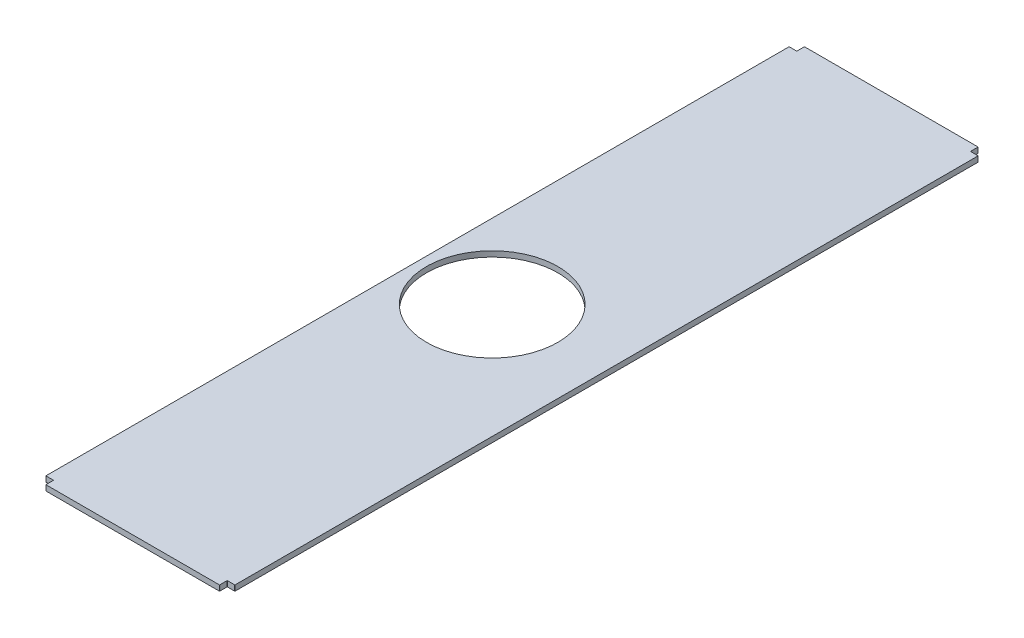
ISO-10303-21;
HEADER;
FILE_DESCRIPTION(('STEP AP214'),'2;1');
FILE_NAME('part.step','',(''),(''),'','','');
FILE_SCHEMA(('AUTOMOTIVE_DESIGN { 1 0 10303 214 1 1 1 1 }'));
ENDSEC;
DATA;
#1=APPLICATION_CONTEXT('core data for automotive mechanical design processes');
#2=APPLICATION_PROTOCOL_DEFINITION('international standard','automotive_design',2000,#1);
#3=PRODUCT_CONTEXT('',#1,'mechanical');
#4=PRODUCT('Part','Part','',(#3));
#5=PRODUCT_RELATED_PRODUCT_CATEGORY('part','',(#4));
#6=PRODUCT_DEFINITION_FORMATION('','',#4);
#7=PRODUCT_DEFINITION_CONTEXT('part definition',#1,'design');
#8=PRODUCT_DEFINITION('design','',#6,#7);
#9=PRODUCT_DEFINITION_SHAPE('','',#8);
#10=(LENGTH_UNIT() NAMED_UNIT(*) SI_UNIT(.MILLI.,.METRE.));
#11=(NAMED_UNIT(*) PLANE_ANGLE_UNIT() SI_UNIT($,.RADIAN.));
#12=(NAMED_UNIT(*) SI_UNIT($,.STERADIAN.) SOLID_ANGLE_UNIT());
#13=UNCERTAINTY_MEASURE_WITH_UNIT(LENGTH_MEASURE(1.E-05),#10,'distance_accuracy_value','');
#14=(GEOMETRIC_REPRESENTATION_CONTEXT(3) GLOBAL_UNCERTAINTY_ASSIGNED_CONTEXT((#13)) GLOBAL_UNIT_ASSIGNED_CONTEXT((#10,
#11,#12)) REPRESENTATION_CONTEXT('',''));
#15=CARTESIAN_POINT('',(0.,0.,0.));
#16=DIRECTION('',(0.,0.,1.));
#17=DIRECTION('',(1.,0.,0.));
#18=AXIS2_PLACEMENT_3D('',#15,#16,#17);
#19=CARTESIAN_POINT('',(0.,6.35,-879.7036));
#20=DIRECTION('',(0.,0.,1.));
#21=DIRECTION('',(1.,0.,0.));
#22=AXIS2_PLACEMENT_3D('',#19,#20,#21);
#23=PLANE('',#22);
#24=DIRECTION('',(-1.,0.,0.));
#25=VECTOR('',#24,1.);
#26=CARTESIAN_POINT('',(0.,6.35,-879.7036));
#27=LINE('',#26,#25);
#28=CARTESIAN_POINT('',(210.058,6.35,-879.7036));
#29=VERTEX_POINT('',#28);
#30=CARTESIAN_POINT('',(9.144,6.35,-879.7036));
#31=VERTEX_POINT('',#30);
#32=EDGE_CURVE('E272',#29,#31,#27,.T.);
#33=ORIENTED_EDGE('',*,*,#32,.F.);
#34=DIRECTION('',(0.,1.,0.));
#35=VECTOR('',#34,1.);
#36=CARTESIAN_POINT('',(210.058,6.35,-879.7036));
#37=LINE('',#36,#35);
#38=CARTESIAN_POINT('',(210.058,0.,-879.7036));
#39=VERTEX_POINT('',#38);
#40=EDGE_CURVE('E210',#29,#39,#37,.F.);
#41=ORIENTED_EDGE('',*,*,#40,.T.);
#42=DIRECTION('',(-1.,0.,0.));
#43=VECTOR('',#42,1.);
#44=CARTESIAN_POINT('',(0.,0.,-879.7036));
#45=LINE('',#44,#43);
#46=CARTESIAN_POINT('',(9.144,0.,-879.7036));
#47=VERTEX_POINT('',#46);
#48=EDGE_CURVE('E266',#39,#47,#45,.T.);
#49=ORIENTED_EDGE('',*,*,#48,.T.);
#50=DIRECTION('',(0.,1.,0.));
#51=VECTOR('',#50,1.);
#52=CARTESIAN_POINT('',(9.144,6.35,-879.7036));
#53=LINE('',#52,#51);
#54=EDGE_CURVE('E216',#47,#31,#53,.T.);
#55=ORIENTED_EDGE('',*,*,#54,.T.);
#56=EDGE_LOOP('',(#33,#41,#49,#55));
#57=FACE_BOUND('',#56,.T.);
#58=ADVANCED_FACE('F42',(#57),#23,.F.);
#59=CARTESIAN_POINT('',(0.,6.35,0.));
#60=DIRECTION('',(1.,0.,0.));
#61=DIRECTION('',(0.,0.,-1.));
#62=AXIS2_PLACEMENT_3D('',#59,#60,#61);
#63=PLANE('',#62);
#64=DIRECTION('',(0.,0.,1.));
#65=VECTOR('',#64,1.);
#66=CARTESIAN_POINT('',(0.,6.35,0.));
#67=LINE('',#66,#65);
#68=CARTESIAN_POINT('',(0.,6.35,-870.5596));
#69=VERTEX_POINT('',#68);
#70=CARTESIAN_POINT('',(0.,6.35,-9.144));
#71=VERTEX_POINT('',#70);
#72=EDGE_CURVE('E275',#69,#71,#67,.T.);
#73=ORIENTED_EDGE('',*,*,#72,.F.);
#74=DIRECTION('',(0.,1.,0.));
#75=VECTOR('',#74,1.);
#76=CARTESIAN_POINT('',(0.,6.35,-870.5596));
#77=LINE('',#76,#75);
#78=CARTESIAN_POINT('',(0.,0.,-870.5596));
#79=VERTEX_POINT('',#78);
#80=EDGE_CURVE('E65',#69,#79,#77,.F.);
#81=ORIENTED_EDGE('',*,*,#80,.T.);
#82=DIRECTION('',(0.,0.,1.));
#83=VECTOR('',#82,1.);
#84=CARTESIAN_POINT('',(0.,0.,0.));
#85=LINE('',#84,#83);
#86=CARTESIAN_POINT('',(0.,0.,-9.144));
#87=VERTEX_POINT('',#86);
#88=EDGE_CURVE('E291',#79,#87,#85,.T.);
#89=ORIENTED_EDGE('',*,*,#88,.T.);
#90=DIRECTION('',(0.,1.,0.));
#91=VECTOR('',#90,1.);
#92=CARTESIAN_POINT('',(0.,6.35,-9.144));
#93=LINE('',#92,#91);
#94=EDGE_CURVE('E371',#87,#71,#93,.T.);
#95=ORIENTED_EDGE('',*,*,#94,.T.);
#96=EDGE_LOOP('',(#73,#81,#89,#95));
#97=FACE_BOUND('',#96,.T.);
#98=ADVANCED_FACE('F511',(#97),#63,.F.);
#99=CARTESIAN_POINT('',(219.202,6.35,0.));
#100=DIRECTION('',(0.,0.,-1.));
#101=DIRECTION('',(-1.,0.,0.));
#102=AXIS2_PLACEMENT_3D('',#99,#100,#101);
#103=PLANE('',#102);
#104=DIRECTION('',(1.,0.,0.));
#105=VECTOR('',#104,1.);
#106=CARTESIAN_POINT('',(219.202,6.35,0.));
#107=LINE('',#106,#105);
#108=CARTESIAN_POINT('',(9.14399999999999,6.35,0.));
#109=VERTEX_POINT('',#108);
#110=CARTESIAN_POINT('',(210.058,6.35,0.));
#111=VERTEX_POINT('',#110);
#112=EDGE_CURVE('E280',#109,#111,#107,.T.);
#113=ORIENTED_EDGE('',*,*,#112,.F.);
#114=DIRECTION('',(0.,1.,0.));
#115=VECTOR('',#114,1.);
#116=CARTESIAN_POINT('',(9.14399999999999,6.35,0.));
#117=LINE('',#116,#115);
#118=CARTESIAN_POINT('',(9.14399999999999,0.,0.));
#119=VERTEX_POINT('',#118);
#120=EDGE_CURVE('E395',#109,#119,#117,.F.);
#121=ORIENTED_EDGE('',*,*,#120,.T.);
#122=DIRECTION('',(1.,0.,0.));
#123=VECTOR('',#122,1.);
#124=CARTESIAN_POINT('',(219.202,0.,0.));
#125=LINE('',#124,#123);
#126=CARTESIAN_POINT('',(210.058,0.,0.));
#127=VERTEX_POINT('',#126);
#128=EDGE_CURVE('E294',#119,#127,#125,.T.);
#129=ORIENTED_EDGE('',*,*,#128,.T.);
#130=DIRECTION('',(0.,1.,0.));
#131=VECTOR('',#130,1.);
#132=CARTESIAN_POINT('',(210.058,6.35,0.));
#133=LINE('',#132,#131);
#134=EDGE_CURVE('E391',#127,#111,#133,.T.);
#135=ORIENTED_EDGE('',*,*,#134,.T.);
#136=EDGE_LOOP('',(#113,#121,#129,#135));
#137=FACE_BOUND('',#136,.T.);
#138=ADVANCED_FACE('F517',(#137),#103,.F.);
#139=CARTESIAN_POINT('',(219.202,6.35,0.));
#140=DIRECTION('',(-1.,0.,0.));
#141=DIRECTION('',(0.,0.,1.));
#142=AXIS2_PLACEMENT_3D('',#139,#140,#141);
#143=PLANE('',#142);
#144=DIRECTION('',(0.,0.,-1.));
#145=VECTOR('',#144,1.);
#146=CARTESIAN_POINT('',(219.202,0.,0.));
#147=LINE('',#146,#145);
#148=CARTESIAN_POINT('',(219.202,0.,-9.144));
#149=VERTEX_POINT('',#148);
#150=CARTESIAN_POINT('',(219.202,0.,-870.5596));
#151=VERTEX_POINT('',#150);
#152=EDGE_CURVE('E276',#149,#151,#147,.T.);
#153=ORIENTED_EDGE('',*,*,#152,.T.);
#154=DIRECTION('',(0.,1.,0.));
#155=VECTOR('',#154,1.);
#156=CARTESIAN_POINT('',(219.202,6.35,-870.5596));
#157=LINE('',#156,#155);
#158=CARTESIAN_POINT('',(219.202,6.35,-870.5596));
#159=VERTEX_POINT('',#158);
#160=EDGE_CURVE('E360',#151,#159,#157,.T.);
#161=ORIENTED_EDGE('',*,*,#160,.T.);
#162=DIRECTION('',(0.,0.,-1.));
#163=VECTOR('',#162,1.);
#164=CARTESIAN_POINT('',(219.202,6.35,0.));
#165=LINE('',#164,#163);
#166=CARTESIAN_POINT('',(219.202,6.35,-9.144));
#167=VERTEX_POINT('',#166);
#168=EDGE_CURVE('E284',#167,#159,#165,.T.);
#169=ORIENTED_EDGE('',*,*,#168,.F.);
#170=DIRECTION('',(0.,1.,0.));
#171=VECTOR('',#170,1.);
#172=CARTESIAN_POINT('',(219.202,6.35,-9.144));
#173=LINE('',#172,#171);
#174=EDGE_CURVE('E357',#167,#149,#173,.F.);
#175=ORIENTED_EDGE('',*,*,#174,.T.);
#176=EDGE_LOOP('',(#153,#161,#169,#175));
#177=FACE_BOUND('',#176,.T.);
#178=ADVANCED_FACE('F495',(#177),#143,.F.);
#179=CARTESIAN_POINT('',(0.,6.35,0.));
#180=DIRECTION('',(0.,1.,0.));
#181=DIRECTION('',(0.,0.,1.));
#182=AXIS2_PLACEMENT_3D('',#179,#180,#181);
#183=PLANE('',#182);
#184=DIRECTION('',(0.,0.,1.));
#185=VECTOR('',#184,1.);
#186=CARTESIAN_POINT('',(210.312,6.35,-879.7036));
#187=LINE('',#186,#185);
#188=CARTESIAN_POINT('',(210.312,6.35,-879.4496));
#189=VERTEX_POINT('',#188);
#190=CARTESIAN_POINT('',(210.312,6.35,-871.0676));
#191=VERTEX_POINT('',#190);
#192=EDGE_CURVE('E223',#189,#191,#187,.T.);
#193=ORIENTED_EDGE('',*,*,#192,.F.);
#194=CARTESIAN_POINT('',(210.058,6.35,-879.4496));
#195=DIRECTION('',(0.,1.,0.));
#196=DIRECTION('',(0.,0.,1.));
#197=AXIS2_PLACEMENT_3D('',#194,#195,#196);
#198=CIRCLE('',#197,0.254);
#199=EDGE_CURVE('E205',#189,#29,#198,.T.);
#200=ORIENTED_EDGE('',*,*,#199,.T.);
#201=ORIENTED_EDGE('',*,*,#32,.T.);
#202=CARTESIAN_POINT('',(9.144,6.35,-879.4496));
#203=DIRECTION('',(0.,1.,0.));
#204=DIRECTION('',(0.,0.,1.));
#205=AXIS2_PLACEMENT_3D('',#202,#203,#204);
#206=CIRCLE('',#205,0.254);
#207=CARTESIAN_POINT('',(8.89,6.35,-879.4496));
#208=VERTEX_POINT('',#207);
#209=EDGE_CURVE('E314',#31,#208,#206,.T.);
#210=ORIENTED_EDGE('',*,*,#209,.T.);
#211=DIRECTION('',(0.,0.,-1.));
#212=VECTOR('',#211,1.);
#213=CARTESIAN_POINT('',(8.89,6.35,-879.7036));
#214=LINE('',#213,#212);
#215=CARTESIAN_POINT('',(8.89,6.35,-871.0676));
#216=VERTEX_POINT('',#215);
#217=EDGE_CURVE('E253',#216,#208,#214,.T.);
#218=ORIENTED_EDGE('',*,*,#217,.F.);
#219=CARTESIAN_POINT('',(8.636,6.35,-871.0676));
#220=DIRECTION('',(0.,1.,0.));
#221=DIRECTION('',(0.,0.,1.));
#222=AXIS2_PLACEMENT_3D('',#219,#220,#221);
#223=CIRCLE('',#222,0.254);
#224=CARTESIAN_POINT('',(8.636,6.35,-870.8136));
#225=VERTEX_POINT('',#224);
#226=EDGE_CURVE('E424',#216,#225,#223,.F.);
#227=ORIENTED_EDGE('',*,*,#226,.T.);
#228=DIRECTION('',(1.,0.,0.));
#229=VECTOR('',#228,1.);
#230=CARTESIAN_POINT('',(0.,6.35,-870.8136));
#231=LINE('',#230,#229);
#232=CARTESIAN_POINT('',(0.254,6.35,-870.8136));
#233=VERTEX_POINT('',#232);
#234=EDGE_CURVE('E255',#233,#225,#231,.T.);
#235=ORIENTED_EDGE('',*,*,#234,.F.);
#236=CARTESIAN_POINT('',(0.254,6.35,-870.5596));
#237=DIRECTION('',(0.,1.,0.));
#238=DIRECTION('',(0.,0.,1.));
#239=AXIS2_PLACEMENT_3D('',#236,#237,#238);
#240=CIRCLE('',#239,0.254);
#241=EDGE_CURVE('E317',#233,#69,#240,.T.);
#242=ORIENTED_EDGE('',*,*,#241,.T.);
#243=ORIENTED_EDGE('',*,*,#72,.T.);
#244=CARTESIAN_POINT('',(0.254,6.35,-9.144));
#245=DIRECTION('',(0.,1.,0.));
#246=DIRECTION('',(0.,0.,1.));
#247=AXIS2_PLACEMENT_3D('',#244,#245,#246);
#248=CIRCLE('',#247,0.254);
#249=CARTESIAN_POINT('',(0.254,6.35,-8.89));
#250=VERTEX_POINT('',#249);
#251=EDGE_CURVE('E308',#71,#250,#248,.T.);
#252=ORIENTED_EDGE('',*,*,#251,.T.);
#253=DIRECTION('',(-1.,0.,0.));
#254=VECTOR('',#253,1.);
#255=CARTESIAN_POINT('',(0.,6.35,-8.89));
#256=LINE('',#255,#254);
#257=CARTESIAN_POINT('',(8.636,6.35,-8.89));
#258=VERTEX_POINT('',#257);
#259=EDGE_CURVE('E472',#258,#250,#256,.T.);
#260=ORIENTED_EDGE('',*,*,#259,.F.);
#261=CARTESIAN_POINT('',(8.636,6.35,-8.636));
#262=DIRECTION('',(0.,1.,0.));
#263=DIRECTION('',(0.,0.,1.));
#264=AXIS2_PLACEMENT_3D('',#261,#262,#263);
#265=CIRCLE('',#264,0.254);
#266=CARTESIAN_POINT('',(8.89,6.35,-8.636));
#267=VERTEX_POINT('',#266);
#268=EDGE_CURVE('E430',#258,#267,#265,.F.);
#269=ORIENTED_EDGE('',*,*,#268,.T.);
#270=DIRECTION('',(0.,0.,-1.));
#271=VECTOR('',#270,1.);
#272=CARTESIAN_POINT('',(8.89,6.35,0.));
#273=LINE('',#272,#271);
#274=CARTESIAN_POINT('',(8.89,6.35,-0.254));
#275=VERTEX_POINT('',#274);
#276=EDGE_CURVE('E466',#275,#267,#273,.T.);
#277=ORIENTED_EDGE('',*,*,#276,.F.);
#278=CARTESIAN_POINT('',(9.144,6.35,-0.254));
#279=DIRECTION('',(0.,1.,0.));
#280=DIRECTION('',(0.,0.,1.));
#281=AXIS2_PLACEMENT_3D('',#278,#279,#280);
#282=CIRCLE('',#281,0.254);
#283=EDGE_CURVE('E311',#275,#109,#282,.T.);
#284=ORIENTED_EDGE('',*,*,#283,.T.);
#285=ORIENTED_EDGE('',*,*,#112,.T.);
#286=CARTESIAN_POINT('',(210.058,6.35,-0.254000000000002));
#287=DIRECTION('',(0.,1.,0.));
#288=DIRECTION('',(0.,0.,1.));
#289=AXIS2_PLACEMENT_3D('',#286,#287,#288);
#290=CIRCLE('',#289,0.254);
#291=CARTESIAN_POINT('',(210.312,6.35,-0.254000000000002));
#292=VERTEX_POINT('',#291);
#293=EDGE_CURVE('E228',#111,#292,#290,.T.);
#294=ORIENTED_EDGE('',*,*,#293,.T.);
#295=DIRECTION('',(0.,0.,1.));
#296=VECTOR('',#295,1.);
#297=CARTESIAN_POINT('',(210.312,6.35,0.));
#298=LINE('',#297,#296);
#299=CARTESIAN_POINT('',(210.312,6.35,-8.636));
#300=VERTEX_POINT('',#299);
#301=EDGE_CURVE('E442',#300,#292,#298,.T.);
#302=ORIENTED_EDGE('',*,*,#301,.F.);
#303=CARTESIAN_POINT('',(210.566,6.35,-8.636));
#304=DIRECTION('',(0.,1.,0.));
#305=DIRECTION('',(0.,0.,1.));
#306=AXIS2_PLACEMENT_3D('',#303,#304,#305);
#307=CIRCLE('',#306,0.254);
#308=CARTESIAN_POINT('',(210.566,6.35,-8.89));
#309=VERTEX_POINT('',#308);
#310=EDGE_CURVE('E51',#300,#309,#307,.F.);
#311=ORIENTED_EDGE('',*,*,#310,.T.);
#312=DIRECTION('',(-1.,0.,0.));
#313=VECTOR('',#312,1.);
#314=CARTESIAN_POINT('',(219.202,6.35,-8.89));
#315=LINE('',#314,#313);
#316=CARTESIAN_POINT('',(218.948,6.35,-8.89));
#317=VERTEX_POINT('',#316);
#318=EDGE_CURVE('E440',#317,#309,#315,.T.);
#319=ORIENTED_EDGE('',*,*,#318,.F.);
#320=CARTESIAN_POINT('',(218.948,6.35,-9.144));
#321=DIRECTION('',(0.,1.,0.));
#322=DIRECTION('',(0.,0.,1.));
#323=AXIS2_PLACEMENT_3D('',#320,#321,#322);
#324=CIRCLE('',#323,0.254);
#325=EDGE_CURVE('E305',#317,#167,#324,.T.);
#326=ORIENTED_EDGE('',*,*,#325,.T.);
#327=ORIENTED_EDGE('',*,*,#168,.T.);
#328=CARTESIAN_POINT('',(218.948,6.35,-870.5596));
#329=DIRECTION('',(0.,1.,0.));
#330=DIRECTION('',(0.,0.,1.));
#331=AXIS2_PLACEMENT_3D('',#328,#329,#330);
#332=CIRCLE('',#331,0.254);
#333=CARTESIAN_POINT('',(218.948,6.35,-870.8136));
#334=VERTEX_POINT('',#333);
#335=EDGE_CURVE('E217',#159,#334,#332,.T.);
#336=ORIENTED_EDGE('',*,*,#335,.T.);
#337=DIRECTION('',(1.,0.,0.));
#338=VECTOR('',#337,1.);
#339=CARTESIAN_POINT('',(219.202,6.35,-870.8136));
#340=LINE('',#339,#338);
#341=CARTESIAN_POINT('',(210.566,6.35,-870.8136));
#342=VERTEX_POINT('',#341);
#343=EDGE_CURVE('E236',#342,#334,#340,.T.);
#344=ORIENTED_EDGE('',*,*,#343,.F.);
#345=CARTESIAN_POINT('',(210.566,6.35,-871.0676));
#346=DIRECTION('',(0.,1.,0.));
#347=DIRECTION('',(0.,0.,1.));
#348=AXIS2_PLACEMENT_3D('',#345,#346,#347);
#349=CIRCLE('',#348,0.254);
#350=EDGE_CURVE('E234',#342,#191,#349,.F.);
#351=ORIENTED_EDGE('',*,*,#350,.T.);
#352=EDGE_LOOP('',(#193,#200,#201,#210,#218,#227,#235,#242,#243,#252,#260,#269,#277,#284,#285,
#294,#302,#311,#319,#326,#327,#336,#344,#351));
#353=FACE_BOUND('',#352,.T.);
#354=CARTESIAN_POINT('',(86.6393999999993,6.35,-439.851800000002));
#355=DIRECTION('',(0.,1.,0.));
#356=DIRECTION('',(0.,0.,1.));
#357=AXIS2_PLACEMENT_3D('',#354,#355,#356);
#358=CIRCLE('',#357,76.2);
#359=CARTESIAN_POINT('',(86.6393999999993,6.35,-363.651800000002));
#360=VERTEX_POINT('',#359);
#361=EDGE_CURVE('E267',#360,#360,#358,.T.);
#362=ORIENTED_EDGE('',*,*,#361,.F.);
#363=EDGE_LOOP('',(#362));
#364=FACE_BOUND('',#363,.T.);
#365=ADVANCED_FACE('F231',(#353,#364),#183,.T.);
#366=CARTESIAN_POINT('',(0.,0.,0.));
#367=DIRECTION('',(0.,1.,0.));
#368=DIRECTION('',(0.,0.,1.));
#369=AXIS2_PLACEMENT_3D('',#366,#367,#368);
#370=PLANE('',#369);
#371=CARTESIAN_POINT('',(86.6393999999993,0.,-439.851800000002));
#372=DIRECTION('',(0.,1.,0.));
#373=DIRECTION('',(0.,0.,1.));
#374=AXIS2_PLACEMENT_3D('',#371,#372,#373);
#375=CIRCLE('',#374,76.2);
#376=CARTESIAN_POINT('',(86.6393999999993,0.,-363.651800000002));
#377=VERTEX_POINT('',#376);
#378=EDGE_CURVE('E262',#377,#377,#375,.T.);
#379=ORIENTED_EDGE('',*,*,#378,.T.);
#380=EDGE_LOOP('',(#379));
#381=FACE_BOUND('',#380,.T.);
#382=ORIENTED_EDGE('',*,*,#48,.F.);
#383=CARTESIAN_POINT('',(210.058,0.,-879.4496));
#384=DIRECTION('',(0.,1.,0.));
#385=DIRECTION('',(0.,0.,1.));
#386=AXIS2_PLACEMENT_3D('',#383,#384,#385);
#387=CIRCLE('',#386,0.254);
#388=CARTESIAN_POINT('',(210.312,0.,-879.4496));
#389=VERTEX_POINT('',#388);
#390=EDGE_CURVE('E347',#39,#389,#387,.F.);
#391=ORIENTED_EDGE('',*,*,#390,.T.);
#392=DIRECTION('',(0.,0.,1.));
#393=VECTOR('',#392,1.);
#394=CARTESIAN_POINT('',(210.312,0.,-879.7036));
#395=LINE('',#394,#393);
#396=CARTESIAN_POINT('',(210.312,0.,-871.0676));
#397=VERTEX_POINT('',#396);
#398=EDGE_CURVE('E226',#389,#397,#395,.T.);
#399=ORIENTED_EDGE('',*,*,#398,.T.);
#400=CARTESIAN_POINT('',(210.566,0.,-871.0676));
#401=DIRECTION('',(0.,1.,0.));
#402=DIRECTION('',(0.,0.,1.));
#403=AXIS2_PLACEMENT_3D('',#400,#401,#402);
#404=CIRCLE('',#403,0.254);
#405=CARTESIAN_POINT('',(210.566,0.,-870.8136));
#406=VERTEX_POINT('',#405);
#407=EDGE_CURVE('E421',#397,#406,#404,.T.);
#408=ORIENTED_EDGE('',*,*,#407,.T.);
#409=DIRECTION('',(1.,0.,0.));
#410=VECTOR('',#409,1.);
#411=CARTESIAN_POINT('',(219.202,0.,-870.8136));
#412=LINE('',#411,#410);
#413=CARTESIAN_POINT('',(218.948,0.,-870.8136));
#414=VERTEX_POINT('',#413);
#415=EDGE_CURVE('E248',#406,#414,#412,.T.);
#416=ORIENTED_EDGE('',*,*,#415,.T.);
#417=CARTESIAN_POINT('',(218.948,0.,-870.5596));
#418=DIRECTION('',(0.,1.,0.));
#419=DIRECTION('',(0.,0.,1.));
#420=AXIS2_PLACEMENT_3D('',#417,#418,#419);
#421=CIRCLE('',#420,0.254);
#422=EDGE_CURVE('E344',#414,#151,#421,.F.);
#423=ORIENTED_EDGE('',*,*,#422,.T.);
#424=ORIENTED_EDGE('',*,*,#152,.F.);
#425=CARTESIAN_POINT('',(218.948,0.,-9.144));
#426=DIRECTION('',(0.,1.,0.));
#427=DIRECTION('',(0.,0.,1.));
#428=AXIS2_PLACEMENT_3D('',#425,#426,#427);
#429=CIRCLE('',#428,0.254);
#430=CARTESIAN_POINT('',(218.948,0.,-8.89));
#431=VERTEX_POINT('',#430);
#432=EDGE_CURVE('E330',#149,#431,#429,.F.);
#433=ORIENTED_EDGE('',*,*,#432,.T.);
#434=DIRECTION('',(-1.,0.,0.));
#435=VECTOR('',#434,1.);
#436=CARTESIAN_POINT('',(219.202,0.,-8.89));
#437=LINE('',#436,#435);
#438=CARTESIAN_POINT('',(210.566,0.,-8.89));
#439=VERTEX_POINT('',#438);
#440=EDGE_CURVE('E461',#431,#439,#437,.T.);
#441=ORIENTED_EDGE('',*,*,#440,.T.);
#442=CARTESIAN_POINT('',(210.566,0.,-8.636));
#443=DIRECTION('',(0.,1.,0.));
#444=DIRECTION('',(0.,0.,1.));
#445=AXIS2_PLACEMENT_3D('',#442,#443,#444);
#446=CIRCLE('',#445,0.254);
#447=CARTESIAN_POINT('',(210.312,0.,-8.636));
#448=VERTEX_POINT('',#447);
#449=EDGE_CURVE('E11',#439,#448,#446,.T.);
#450=ORIENTED_EDGE('',*,*,#449,.T.);
#451=DIRECTION('',(0.,0.,1.));
#452=VECTOR('',#451,1.);
#453=CARTESIAN_POINT('',(210.312,0.,0.));
#454=LINE('',#453,#452);
#455=CARTESIAN_POINT('',(210.312,0.,-0.254000000000002));
#456=VERTEX_POINT('',#455);
#457=EDGE_CURVE('E459',#448,#456,#454,.T.);
#458=ORIENTED_EDGE('',*,*,#457,.T.);
#459=CARTESIAN_POINT('',(210.058,0.,-0.254000000000002));
#460=DIRECTION('',(0.,1.,0.));
#461=DIRECTION('',(0.,0.,1.));
#462=AXIS2_PLACEMENT_3D('',#459,#460,#461);
#463=CIRCLE('',#462,0.254);
#464=EDGE_CURVE('E327',#456,#127,#463,.F.);
#465=ORIENTED_EDGE('',*,*,#464,.T.);
#466=ORIENTED_EDGE('',*,*,#128,.F.);
#467=CARTESIAN_POINT('',(9.144,0.,-0.254));
#468=DIRECTION('',(0.,1.,0.));
#469=DIRECTION('',(0.,0.,1.));
#470=AXIS2_PLACEMENT_3D('',#467,#468,#469);
#471=CIRCLE('',#470,0.254);
#472=CARTESIAN_POINT('',(8.89,0.,-0.254));
#473=VERTEX_POINT('',#472);
#474=EDGE_CURVE('E335',#119,#473,#471,.F.);
#475=ORIENTED_EDGE('',*,*,#474,.T.);
#476=DIRECTION('',(0.,0.,-1.));
#477=VECTOR('',#476,1.);
#478=CARTESIAN_POINT('',(8.89,0.,0.));
#479=LINE('',#478,#477);
#480=CARTESIAN_POINT('',(8.89,0.,-8.636));
#481=VERTEX_POINT('',#480);
#482=EDGE_CURVE('E556',#473,#481,#479,.T.);
#483=ORIENTED_EDGE('',*,*,#482,.T.);
#484=CARTESIAN_POINT('',(8.636,0.,-8.636));
#485=DIRECTION('',(0.,1.,0.));
#486=DIRECTION('',(0.,0.,1.));
#487=AXIS2_PLACEMENT_3D('',#484,#485,#486);
#488=CIRCLE('',#487,0.254);
#489=CARTESIAN_POINT('',(8.636,0.,-8.89));
#490=VERTEX_POINT('',#489);
#491=EDGE_CURVE('E433',#481,#490,#488,.T.);
#492=ORIENTED_EDGE('',*,*,#491,.T.);
#493=DIRECTION('',(-1.,0.,0.));
#494=VECTOR('',#493,1.);
#495=CARTESIAN_POINT('',(0.,0.,-8.89));
#496=LINE('',#495,#494);
#497=CARTESIAN_POINT('',(0.254,0.,-8.89));
#498=VERTEX_POINT('',#497);
#499=EDGE_CURVE('E271',#490,#498,#496,.T.);
#500=ORIENTED_EDGE('',*,*,#499,.T.);
#501=CARTESIAN_POINT('',(0.254,0.,-9.144));
#502=DIRECTION('',(0.,1.,0.));
#503=DIRECTION('',(0.,0.,1.));
#504=AXIS2_PLACEMENT_3D('',#501,#502,#503);
#505=CIRCLE('',#504,0.254);
#506=EDGE_CURVE('E58',#498,#87,#505,.F.);
#507=ORIENTED_EDGE('',*,*,#506,.T.);
#508=ORIENTED_EDGE('',*,*,#88,.F.);
#509=CARTESIAN_POINT('',(0.254,0.,-870.5596));
#510=DIRECTION('',(0.,1.,0.));
#511=DIRECTION('',(0.,0.,1.));
#512=AXIS2_PLACEMENT_3D('',#509,#510,#511);
#513=CIRCLE('',#512,0.254);
#514=CARTESIAN_POINT('',(0.254,0.,-870.8136));
#515=VERTEX_POINT('',#514);
#516=EDGE_CURVE('E341',#79,#515,#513,.F.);
#517=ORIENTED_EDGE('',*,*,#516,.T.);
#518=DIRECTION('',(1.,0.,0.));
#519=VECTOR('',#518,1.);
#520=CARTESIAN_POINT('',(0.,0.,-870.8136));
#521=LINE('',#520,#519);
#522=CARTESIAN_POINT('',(8.636,0.,-870.8136));
#523=VERTEX_POINT('',#522);
#524=EDGE_CURVE('E245',#515,#523,#521,.T.);
#525=ORIENTED_EDGE('',*,*,#524,.T.);
#526=CARTESIAN_POINT('',(8.636,0.,-871.0676));
#527=DIRECTION('',(0.,1.,0.));
#528=DIRECTION('',(0.,0.,1.));
#529=AXIS2_PLACEMENT_3D('',#526,#527,#528);
#530=CIRCLE('',#529,0.254);
#531=CARTESIAN_POINT('',(8.89,0.,-871.0676));
#532=VERTEX_POINT('',#531);
#533=EDGE_CURVE('E427',#523,#532,#530,.T.);
#534=ORIENTED_EDGE('',*,*,#533,.T.);
#535=DIRECTION('',(0.,0.,-1.));
#536=VECTOR('',#535,1.);
#537=CARTESIAN_POINT('',(8.89,0.,-879.7036));
#538=LINE('',#537,#536);
#539=CARTESIAN_POINT('',(8.89,0.,-879.4496));
#540=VERTEX_POINT('',#539);
#541=EDGE_CURVE('E237',#532,#540,#538,.T.);
#542=ORIENTED_EDGE('',*,*,#541,.T.);
#543=CARTESIAN_POINT('',(9.144,0.,-879.4496));
#544=DIRECTION('',(0.,1.,0.));
#545=DIRECTION('',(0.,0.,1.));
#546=AXIS2_PLACEMENT_3D('',#543,#544,#545);
#547=CIRCLE('',#546,0.254);
#548=EDGE_CURVE('E338',#540,#47,#547,.F.);
#549=ORIENTED_EDGE('',*,*,#548,.T.);
#550=EDGE_LOOP('',(#382,#391,#399,#408,#416,#423,#424,#433,#441,#450,#458,#465,#466,#475,#483,
#492,#500,#507,#508,#517,#525,#534,#542,#549));
#551=FACE_BOUND('',#550,.T.);
#552=ADVANCED_FACE('F458',(#381,#551),#370,.F.);
#553=CARTESIAN_POINT('',(86.6393999999993,0.,-439.851800000002));
#554=DIRECTION('',(0.,1.,0.));
#555=DIRECTION('',(0.,0.,1.));
#556=AXIS2_PLACEMENT_3D('',#553,#554,#555);
#557=CYLINDRICAL_SURFACE('',#556,76.2);
#558=ORIENTED_EDGE('',*,*,#378,.F.);
#559=EDGE_LOOP('',(#558));
#560=FACE_BOUND('',#559,.T.);
#561=ORIENTED_EDGE('',*,*,#361,.T.);
#562=EDGE_LOOP('',(#561));
#563=FACE_BOUND('',#562,.T.);
#564=ADVANCED_FACE('F596',(#560,#563),#557,.F.);
#565=CARTESIAN_POINT('',(0.,0.,-8.89));
#566=DIRECTION('',(0.,0.,-1.));
#567=DIRECTION('',(-1.,0.,0.));
#568=AXIS2_PLACEMENT_3D('',#565,#566,#567);
#569=PLANE('',#568);
#570=ORIENTED_EDGE('',*,*,#499,.F.);
#571=DIRECTION('',(0.,1.,0.));
#572=VECTOR('',#571,1.);
#573=CARTESIAN_POINT('',(8.636,6.35,-8.89));
#574=LINE('',#573,#572);
#575=EDGE_CURVE('E401',#490,#258,#574,.T.);
#576=ORIENTED_EDGE('',*,*,#575,.T.);
#577=ORIENTED_EDGE('',*,*,#259,.T.);
#578=DIRECTION('',(0.,1.,0.));
#579=VECTOR('',#578,1.);
#580=CARTESIAN_POINT('',(0.254,0.,-8.89));
#581=LINE('',#580,#579);
#582=EDGE_CURVE('E398',#250,#498,#581,.F.);
#583=ORIENTED_EDGE('',*,*,#582,.T.);
#584=EDGE_LOOP('',(#570,#576,#577,#583));
#585=FACE_BOUND('',#584,.T.);
#586=ADVANCED_FACE('F558',(#585),#569,.F.);
#587=CARTESIAN_POINT('',(8.89,0.,0.));
#588=DIRECTION('',(1.,0.,0.));
#589=DIRECTION('',(0.,0.,-1.));
#590=AXIS2_PLACEMENT_3D('',#587,#588,#589);
#591=PLANE('',#590);
#592=ORIENTED_EDGE('',*,*,#482,.F.);
#593=DIRECTION('',(0.,1.,0.));
#594=VECTOR('',#593,1.);
#595=CARTESIAN_POINT('',(8.89,0.,-0.254));
#596=LINE('',#595,#594);
#597=EDGE_CURVE('E387',#473,#275,#596,.T.);
#598=ORIENTED_EDGE('',*,*,#597,.T.);
#599=ORIENTED_EDGE('',*,*,#276,.T.);
#600=DIRECTION('',(0.,1.,0.));
#601=VECTOR('',#600,1.);
#602=CARTESIAN_POINT('',(8.89,0.,-8.636));
#603=LINE('',#602,#601);
#604=EDGE_CURVE('E384',#267,#481,#603,.F.);
#605=ORIENTED_EDGE('',*,*,#604,.T.);
#606=EDGE_LOOP('',(#592,#598,#599,#605));
#607=FACE_BOUND('',#606,.T.);
#608=ADVANCED_FACE('F617',(#607),#591,.F.);
#609=CARTESIAN_POINT('',(210.312,0.,0.));
#610=DIRECTION('',(-1.,0.,0.));
#611=DIRECTION('',(0.,0.,1.));
#612=AXIS2_PLACEMENT_3D('',#609,#610,#611);
#613=PLANE('',#612);
#614=ORIENTED_EDGE('',*,*,#457,.F.);
#615=DIRECTION('',(0.,1.,0.));
#616=VECTOR('',#615,1.);
#617=CARTESIAN_POINT('',(210.312,6.35,-8.636));
#618=LINE('',#617,#616);
#619=EDGE_CURVE('E415',#448,#300,#618,.T.);
#620=ORIENTED_EDGE('',*,*,#619,.T.);
#621=ORIENTED_EDGE('',*,*,#301,.T.);
#622=DIRECTION('',(0.,1.,0.));
#623=VECTOR('',#622,1.);
#624=CARTESIAN_POINT('',(210.312,0.,-0.254000000000002));
#625=LINE('',#624,#623);
#626=EDGE_CURVE('E412',#292,#456,#625,.F.);
#627=ORIENTED_EDGE('',*,*,#626,.T.);
#628=EDGE_LOOP('',(#614,#620,#621,#627));
#629=FACE_BOUND('',#628,.T.);
#630=ADVANCED_FACE('F463',(#629),#613,.F.);
#631=CARTESIAN_POINT('',(219.202,0.,-8.89));
#632=DIRECTION('',(0.,0.,-1.));
#633=DIRECTION('',(-1.,0.,0.));
#634=AXIS2_PLACEMENT_3D('',#631,#632,#633);
#635=PLANE('',#634);
#636=ORIENTED_EDGE('',*,*,#440,.F.);
#637=DIRECTION('',(0.,1.,0.));
#638=VECTOR('',#637,1.);
#639=CARTESIAN_POINT('',(218.948,0.,-8.89));
#640=LINE('',#639,#638);
#641=EDGE_CURVE('E408',#431,#317,#640,.T.);
#642=ORIENTED_EDGE('',*,*,#641,.T.);
#643=ORIENTED_EDGE('',*,*,#318,.T.);
#644=DIRECTION('',(0.,1.,0.));
#645=VECTOR('',#644,1.);
#646=CARTESIAN_POINT('',(210.566,0.,-8.89));
#647=LINE('',#646,#645);
#648=EDGE_CURVE('E405',#309,#439,#647,.F.);
#649=ORIENTED_EDGE('',*,*,#648,.T.);
#650=EDGE_LOOP('',(#636,#642,#643,#649));
#651=FACE_BOUND('',#650,.T.);
#652=ADVANCED_FACE('F448',(#651),#635,.F.);
#653=CARTESIAN_POINT('',(219.202,0.,-870.8136));
#654=DIRECTION('',(0.,0.,1.));
#655=DIRECTION('',(1.,0.,0.));
#656=AXIS2_PLACEMENT_3D('',#653,#654,#655);
#657=PLANE('',#656);
#658=ORIENTED_EDGE('',*,*,#415,.F.);
#659=DIRECTION('',(0.,1.,0.));
#660=VECTOR('',#659,1.);
#661=CARTESIAN_POINT('',(210.566,6.35,-870.8136));
#662=LINE('',#661,#660);
#663=EDGE_CURVE('E353',#406,#342,#662,.T.);
#664=ORIENTED_EDGE('',*,*,#663,.T.);
#665=ORIENTED_EDGE('',*,*,#343,.T.);
#666=DIRECTION('',(0.,1.,0.));
#667=VECTOR('',#666,1.);
#668=CARTESIAN_POINT('',(218.948,0.,-870.8136));
#669=LINE('',#668,#667);
#670=EDGE_CURVE('E350',#334,#414,#669,.F.);
#671=ORIENTED_EDGE('',*,*,#670,.T.);
#672=EDGE_LOOP('',(#658,#664,#665,#671));
#673=FACE_BOUND('',#672,.T.);
#674=ADVANCED_FACE('F592',(#673),#657,.F.);
#675=CARTESIAN_POINT('',(210.312,0.,-879.7036));
#676=DIRECTION('',(-1.,0.,0.));
#677=DIRECTION('',(0.,0.,1.));
#678=AXIS2_PLACEMENT_3D('',#675,#676,#677);
#679=PLANE('',#678);
#680=ORIENTED_EDGE('',*,*,#398,.F.);
#681=DIRECTION('',(0.,1.,0.));
#682=VECTOR('',#681,1.);
#683=CARTESIAN_POINT('',(210.312,0.,-879.4496));
#684=LINE('',#683,#682);
#685=EDGE_CURVE('E209',#389,#189,#684,.T.);
#686=ORIENTED_EDGE('',*,*,#685,.T.);
#687=ORIENTED_EDGE('',*,*,#192,.T.);
#688=DIRECTION('',(0.,1.,0.));
#689=VECTOR('',#688,1.);
#690=CARTESIAN_POINT('',(210.312,0.,-871.0676));
#691=LINE('',#690,#689);
#692=EDGE_CURVE('E229',#191,#397,#691,.F.);
#693=ORIENTED_EDGE('',*,*,#692,.T.);
#694=EDGE_LOOP('',(#680,#686,#687,#693));
#695=FACE_BOUND('',#694,.T.);
#696=ADVANCED_FACE('F222',(#695),#679,.F.);
#697=CARTESIAN_POINT('',(8.89,0.,-879.7036));
#698=DIRECTION('',(1.,0.,0.));
#699=DIRECTION('',(0.,0.,-1.));
#700=AXIS2_PLACEMENT_3D('',#697,#698,#699);
#701=PLANE('',#700);
#702=ORIENTED_EDGE('',*,*,#541,.F.);
#703=DIRECTION('',(0.,1.,0.));
#704=VECTOR('',#703,1.);
#705=CARTESIAN_POINT('',(8.89,6.35,-871.0676));
#706=LINE('',#705,#704);
#707=EDGE_CURVE('E380',#532,#216,#706,.T.);
#708=ORIENTED_EDGE('',*,*,#707,.T.);
#709=ORIENTED_EDGE('',*,*,#217,.T.);
#710=DIRECTION('',(0.,1.,0.));
#711=VECTOR('',#710,1.);
#712=CARTESIAN_POINT('',(8.89,0.,-879.4496));
#713=LINE('',#712,#711);
#714=EDGE_CURVE('E377',#208,#540,#713,.F.);
#715=ORIENTED_EDGE('',*,*,#714,.T.);
#716=EDGE_LOOP('',(#702,#708,#709,#715));
#717=FACE_BOUND('',#716,.T.);
#718=ADVANCED_FACE('F581',(#717),#701,.F.);
#719=CARTESIAN_POINT('',(0.,0.,-870.8136));
#720=DIRECTION('',(0.,0.,1.));
#721=DIRECTION('',(1.,0.,0.));
#722=AXIS2_PLACEMENT_3D('',#719,#720,#721);
#723=PLANE('',#722);
#724=ORIENTED_EDGE('',*,*,#524,.F.);
#725=DIRECTION('',(0.,1.,0.));
#726=VECTOR('',#725,1.);
#727=CARTESIAN_POINT('',(0.254,0.,-870.8136));
#728=LINE('',#727,#726);
#729=EDGE_CURVE('E367',#515,#233,#728,.T.);
#730=ORIENTED_EDGE('',*,*,#729,.T.);
#731=ORIENTED_EDGE('',*,*,#234,.T.);
#732=DIRECTION('',(0.,1.,0.));
#733=VECTOR('',#732,1.);
#734=CARTESIAN_POINT('',(8.636,0.,-870.8136));
#735=LINE('',#734,#733);
#736=EDGE_CURVE('E364',#225,#523,#735,.F.);
#737=ORIENTED_EDGE('',*,*,#736,.T.);
#738=EDGE_LOOP('',(#724,#730,#731,#737));
#739=FACE_BOUND('',#738,.T.);
#740=ADVANCED_FACE('F524',(#739),#723,.F.);
#741=CARTESIAN_POINT('',(210.058,0.,-879.4496));
#742=DIRECTION('',(0.,1.,0.));
#743=DIRECTION('',(0.,0.,1.));
#744=AXIS2_PLACEMENT_3D('',#741,#742,#743);
#745=CYLINDRICAL_SURFACE('',#744,0.254);
#746=ORIENTED_EDGE('',*,*,#390,.F.);
#747=ORIENTED_EDGE('',*,*,#40,.F.);
#748=ORIENTED_EDGE('',*,*,#199,.F.);
#749=ORIENTED_EDGE('',*,*,#685,.F.);
#750=EDGE_LOOP('',(#746,#747,#748,#749));
#751=FACE_BOUND('',#750,.T.);
#752=ADVANCED_FACE('F208',(#751),#745,.T.);
#753=CARTESIAN_POINT('',(210.566,0.,-871.0676));
#754=DIRECTION('',(0.,-1.,0.));
#755=DIRECTION('',(0.,0.,-1.));
#756=AXIS2_PLACEMENT_3D('',#753,#754,#755);
#757=CYLINDRICAL_SURFACE('',#756,0.254);
#758=ORIENTED_EDGE('',*,*,#407,.F.);
#759=ORIENTED_EDGE('',*,*,#692,.F.);
#760=ORIENTED_EDGE('',*,*,#350,.F.);
#761=ORIENTED_EDGE('',*,*,#663,.F.);
#762=EDGE_LOOP('',(#758,#759,#760,#761));
#763=FACE_BOUND('',#762,.T.);
#764=ADVANCED_FACE('F523',(#763),#757,.F.);
#765=CARTESIAN_POINT('',(218.948,6.35,-870.5596));
#766=DIRECTION('',(0.,1.,0.));
#767=DIRECTION('',(0.,0.,1.));
#768=AXIS2_PLACEMENT_3D('',#765,#766,#767);
#769=CYLINDRICAL_SURFACE('',#768,0.254);
#770=ORIENTED_EDGE('',*,*,#422,.F.);
#771=ORIENTED_EDGE('',*,*,#670,.F.);
#772=ORIENTED_EDGE('',*,*,#335,.F.);
#773=ORIENTED_EDGE('',*,*,#160,.F.);
#774=EDGE_LOOP('',(#770,#771,#772,#773));
#775=FACE_BOUND('',#774,.T.);
#776=ADVANCED_FACE('F492',(#775),#769,.T.);
#777=CARTESIAN_POINT('',(0.254,0.,-870.5596));
#778=DIRECTION('',(0.,1.,0.));
#779=DIRECTION('',(0.,0.,1.));
#780=AXIS2_PLACEMENT_3D('',#777,#778,#779);
#781=CYLINDRICAL_SURFACE('',#780,0.254);
#782=ORIENTED_EDGE('',*,*,#516,.F.);
#783=ORIENTED_EDGE('',*,*,#80,.F.);
#784=ORIENTED_EDGE('',*,*,#241,.F.);
#785=ORIENTED_EDGE('',*,*,#729,.F.);
#786=EDGE_LOOP('',(#782,#783,#784,#785));
#787=FACE_BOUND('',#786,.T.);
#788=ADVANCED_FACE('F530',(#787),#781,.T.);
#789=CARTESIAN_POINT('',(8.636,0.,-871.0676));
#790=DIRECTION('',(0.,-1.,0.));
#791=DIRECTION('',(0.,0.,-1.));
#792=AXIS2_PLACEMENT_3D('',#789,#790,#791);
#793=CYLINDRICAL_SURFACE('',#792,0.254);
#794=ORIENTED_EDGE('',*,*,#533,.F.);
#795=ORIENTED_EDGE('',*,*,#736,.F.);
#796=ORIENTED_EDGE('',*,*,#226,.F.);
#797=ORIENTED_EDGE('',*,*,#707,.F.);
#798=EDGE_LOOP('',(#794,#795,#796,#797));
#799=FACE_BOUND('',#798,.T.);
#800=ADVANCED_FACE('F533',(#799),#793,.F.);
#801=CARTESIAN_POINT('',(9.144,6.35,-879.4496));
#802=DIRECTION('',(0.,1.,0.));
#803=DIRECTION('',(0.,0.,1.));
#804=AXIS2_PLACEMENT_3D('',#801,#802,#803);
#805=CYLINDRICAL_SURFACE('',#804,0.254);
#806=ORIENTED_EDGE('',*,*,#548,.F.);
#807=ORIENTED_EDGE('',*,*,#714,.F.);
#808=ORIENTED_EDGE('',*,*,#209,.F.);
#809=ORIENTED_EDGE('',*,*,#54,.F.);
#810=EDGE_LOOP('',(#806,#807,#808,#809));
#811=FACE_BOUND('',#810,.T.);
#812=ADVANCED_FACE('F537',(#811),#805,.T.);
#813=CARTESIAN_POINT('',(9.144,0.,-0.254));
#814=DIRECTION('',(0.,1.,0.));
#815=DIRECTION('',(0.,0.,1.));
#816=AXIS2_PLACEMENT_3D('',#813,#814,#815);
#817=CYLINDRICAL_SURFACE('',#816,0.254);
#818=ORIENTED_EDGE('',*,*,#474,.F.);
#819=ORIENTED_EDGE('',*,*,#120,.F.);
#820=ORIENTED_EDGE('',*,*,#283,.F.);
#821=ORIENTED_EDGE('',*,*,#597,.F.);
#822=EDGE_LOOP('',(#818,#819,#820,#821));
#823=FACE_BOUND('',#822,.T.);
#824=ADVANCED_FACE('F541',(#823),#817,.T.);
#825=CARTESIAN_POINT('',(8.636,0.,-8.636));
#826=DIRECTION('',(0.,-1.,0.));
#827=DIRECTION('',(0.,0.,-1.));
#828=AXIS2_PLACEMENT_3D('',#825,#826,#827);
#829=CYLINDRICAL_SURFACE('',#828,0.254);
#830=ORIENTED_EDGE('',*,*,#491,.F.);
#831=ORIENTED_EDGE('',*,*,#604,.F.);
#832=ORIENTED_EDGE('',*,*,#268,.F.);
#833=ORIENTED_EDGE('',*,*,#575,.F.);
#834=EDGE_LOOP('',(#830,#831,#832,#833));
#835=FACE_BOUND('',#834,.T.);
#836=ADVANCED_FACE('F507',(#835),#829,.F.);
#837=CARTESIAN_POINT('',(0.254,6.35,-9.144));
#838=DIRECTION('',(0.,1.,0.));
#839=DIRECTION('',(0.,0.,1.));
#840=AXIS2_PLACEMENT_3D('',#837,#838,#839);
#841=CYLINDRICAL_SURFACE('',#840,0.254);
#842=ORIENTED_EDGE('',*,*,#506,.F.);
#843=ORIENTED_EDGE('',*,*,#582,.F.);
#844=ORIENTED_EDGE('',*,*,#251,.F.);
#845=ORIENTED_EDGE('',*,*,#94,.F.);
#846=EDGE_LOOP('',(#842,#843,#844,#845));
#847=FACE_BOUND('',#846,.T.);
#848=ADVANCED_FACE('F501',(#847),#841,.T.);
#849=CARTESIAN_POINT('',(218.948,0.,-9.144));
#850=DIRECTION('',(0.,1.,0.));
#851=DIRECTION('',(0.,0.,1.));
#852=AXIS2_PLACEMENT_3D('',#849,#850,#851);
#853=CYLINDRICAL_SURFACE('',#852,0.254);
#854=ORIENTED_EDGE('',*,*,#432,.F.);
#855=ORIENTED_EDGE('',*,*,#174,.F.);
#856=ORIENTED_EDGE('',*,*,#325,.F.);
#857=ORIENTED_EDGE('',*,*,#641,.F.);
#858=EDGE_LOOP('',(#854,#855,#856,#857));
#859=FACE_BOUND('',#858,.T.);
#860=ADVANCED_FACE('F499',(#859),#853,.T.);
#861=CARTESIAN_POINT('',(210.566,0.,-8.636));
#862=DIRECTION('',(0.,-1.,0.));
#863=DIRECTION('',(0.,0.,-1.));
#864=AXIS2_PLACEMENT_3D('',#861,#862,#863);
#865=CYLINDRICAL_SURFACE('',#864,0.254);
#866=ORIENTED_EDGE('',*,*,#449,.F.);
#867=ORIENTED_EDGE('',*,*,#648,.F.);
#868=ORIENTED_EDGE('',*,*,#310,.F.);
#869=ORIENTED_EDGE('',*,*,#619,.F.);
#870=EDGE_LOOP('',(#866,#867,#868,#869));
#871=FACE_BOUND('',#870,.T.);
#872=ADVANCED_FACE('F454',(#871),#865,.F.);
#873=CARTESIAN_POINT('',(210.058,6.35,-0.254000000000002));
#874=DIRECTION('',(0.,1.,0.));
#875=DIRECTION('',(0.,0.,1.));
#876=AXIS2_PLACEMENT_3D('',#873,#874,#875);
#877=CYLINDRICAL_SURFACE('',#876,0.254);
#878=ORIENTED_EDGE('',*,*,#464,.F.);
#879=ORIENTED_EDGE('',*,*,#626,.F.);
#880=ORIENTED_EDGE('',*,*,#293,.F.);
#881=ORIENTED_EDGE('',*,*,#134,.F.);
#882=EDGE_LOOP('',(#878,#879,#880,#881));
#883=FACE_BOUND('',#882,.T.);
#884=ADVANCED_FACE('F44',(#883),#877,.T.);
#885=CLOSED_SHELL('',(#58,#98,#138,#178,#365,#552,#564,#586,#608,#630,#652,#674,#696,#718,#740,
#752,#764,#776,#788,#800,#812,#824,#836,#848,#860,#872,#884));
#886=MANIFOLD_SOLID_BREP('B2',#885);
#887=ADVANCED_BREP_SHAPE_REPRESENTATION('',(#18,#886),#14);
#888=SHAPE_DEFINITION_REPRESENTATION(#9,#887);
ENDSEC;
END-ISO-10303-21;
